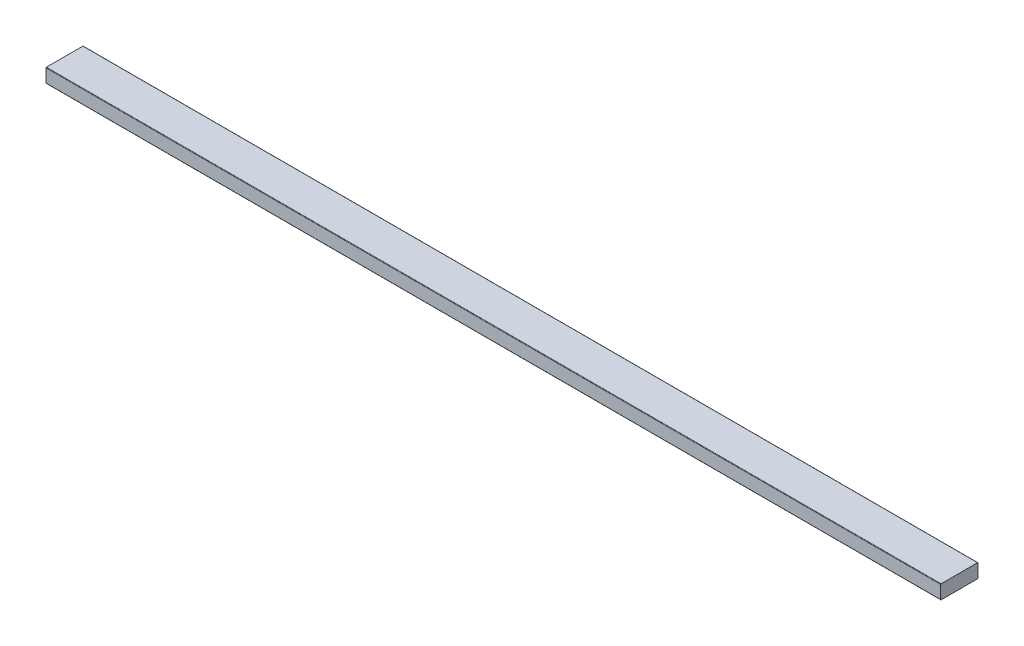
ISO-10303-21;
HEADER;
FILE_DESCRIPTION(('STEP AP214'),'2;1');
FILE_NAME('part.step','',(''),(''),'','','');
FILE_SCHEMA(('AUTOMOTIVE_DESIGN { 1 0 10303 214 1 1 1 1 }'));
ENDSEC;
DATA;
#1=APPLICATION_CONTEXT('core data for automotive mechanical design processes');
#2=APPLICATION_PROTOCOL_DEFINITION('international standard','automotive_design',2000,#1);
#3=PRODUCT_CONTEXT('',#1,'mechanical');
#4=PRODUCT('Part','Part','',(#3));
#5=PRODUCT_RELATED_PRODUCT_CATEGORY('part','',(#4));
#6=PRODUCT_DEFINITION_FORMATION('','',#4);
#7=PRODUCT_DEFINITION_CONTEXT('part definition',#1,'design');
#8=PRODUCT_DEFINITION('design','',#6,#7);
#9=PRODUCT_DEFINITION_SHAPE('','',#8);
#10=(LENGTH_UNIT() NAMED_UNIT(*) SI_UNIT(.MILLI.,.METRE.));
#11=(NAMED_UNIT(*) PLANE_ANGLE_UNIT() SI_UNIT($,.RADIAN.));
#12=(NAMED_UNIT(*) SI_UNIT($,.STERADIAN.) SOLID_ANGLE_UNIT());
#13=UNCERTAINTY_MEASURE_WITH_UNIT(LENGTH_MEASURE(1.E-05),#10,'distance_accuracy_value','');
#14=(GEOMETRIC_REPRESENTATION_CONTEXT(3) GLOBAL_UNCERTAINTY_ASSIGNED_CONTEXT((#13)) GLOBAL_UNIT_ASSIGNED_CONTEXT((#10,
#11,#12)) REPRESENTATION_CONTEXT('',''));
#15=CARTESIAN_POINT('',(0.,0.,0.));
#16=DIRECTION('',(0.,0.,1.));
#17=DIRECTION('',(1.,0.,0.));
#18=AXIS2_PLACEMENT_3D('',#15,#16,#17);
#19=CARTESIAN_POINT('',(-304.8,-4.76250000000001,-12.7));
#20=DIRECTION('',(-1.,0.,0.));
#21=DIRECTION('',(0.,0.,1.));
#22=AXIS2_PLACEMENT_3D('',#19,#20,#21);
#23=PLANE('',#22);
#24=DIRECTION('',(0.,0.,1.));
#25=VECTOR('',#24,1.);
#26=CARTESIAN_POINT('',(-304.8,-4.76250000000001,-12.7));
#27=LINE('',#26,#25);
#28=CARTESIAN_POINT('',(-304.8,-4.76250000000001,-12.385675));
#29=VERTEX_POINT('',#28);
#30=CARTESIAN_POINT('',(-304.8,-4.76250000000001,12.385675));
#31=VERTEX_POINT('',#30);
#32=EDGE_CURVE('E191',#29,#31,#27,.T.);
#33=ORIENTED_EDGE('',*,*,#32,.T.);
#34=CARTESIAN_POINT('',(-304.8,-4.44817500000001,12.385675));
#35=DIRECTION('',(-1.,0.,0.));
#36=DIRECTION('',(0.,0.,1.));
#37=AXIS2_PLACEMENT_3D('',#34,#35,#36);
#38=CIRCLE('',#37,0.314325);
#39=CARTESIAN_POINT('',(-304.8,-4.44817500000001,12.7));
#40=VERTEX_POINT('',#39);
#41=EDGE_CURVE('E169',#31,#40,#38,.T.);
#42=ORIENTED_EDGE('',*,*,#41,.T.);
#43=DIRECTION('',(0.,1.,0.));
#44=VECTOR('',#43,1.);
#45=CARTESIAN_POINT('',(-304.8,-4.76250000000001,12.7));
#46=LINE('',#45,#44);
#47=CARTESIAN_POINT('',(-304.8,4.44817499999999,12.7));
#48=VERTEX_POINT('',#47);
#49=EDGE_CURVE('E130',#40,#48,#46,.T.);
#50=ORIENTED_EDGE('',*,*,#49,.T.);
#51=CARTESIAN_POINT('',(-304.8,4.44817499999999,12.385675));
#52=DIRECTION('',(-1.,0.,0.));
#53=DIRECTION('',(0.,0.,1.));
#54=AXIS2_PLACEMENT_3D('',#51,#52,#53);
#55=CIRCLE('',#54,0.314325);
#56=CARTESIAN_POINT('',(-304.8,4.76249999999999,12.385675));
#57=VERTEX_POINT('',#56);
#58=EDGE_CURVE('E162',#48,#57,#55,.T.);
#59=ORIENTED_EDGE('',*,*,#58,.T.);
#60=DIRECTION('',(0.,0.,1.));
#61=VECTOR('',#60,1.);
#62=CARTESIAN_POINT('',(-304.8,4.76249999999999,-12.7));
#63=LINE('',#62,#61);
#64=CARTESIAN_POINT('',(-304.8,4.76249999999999,-12.385675));
#65=VERTEX_POINT('',#64);
#66=EDGE_CURVE('E186',#65,#57,#63,.T.);
#67=ORIENTED_EDGE('',*,*,#66,.F.);
#68=CARTESIAN_POINT('',(-304.8,4.44817499999999,-12.385675));
#69=DIRECTION('',(-1.,0.,0.));
#70=DIRECTION('',(0.,0.,1.));
#71=AXIS2_PLACEMENT_3D('',#68,#69,#70);
#72=CIRCLE('',#71,0.314325);
#73=CARTESIAN_POINT('',(-304.8,4.44817499999999,-12.7));
#74=VERTEX_POINT('',#73);
#75=EDGE_CURVE('E57',#65,#74,#72,.T.);
#76=ORIENTED_EDGE('',*,*,#75,.T.);
#77=DIRECTION('',(0.,1.,0.));
#78=VECTOR('',#77,1.);
#79=CARTESIAN_POINT('',(-304.8,-4.76250000000001,-12.7));
#80=LINE('',#79,#78);
#81=CARTESIAN_POINT('',(-304.8,-4.44817500000001,-12.7));
#82=VERTEX_POINT('',#81);
#83=EDGE_CURVE('E143',#82,#74,#80,.T.);
#84=ORIENTED_EDGE('',*,*,#83,.F.);
#85=CARTESIAN_POINT('',(-304.8,-4.44817500000001,-12.385675));
#86=DIRECTION('',(-1.,0.,0.));
#87=DIRECTION('',(0.,0.,1.));
#88=AXIS2_PLACEMENT_3D('',#85,#86,#87);
#89=CIRCLE('',#88,0.314325);
#90=EDGE_CURVE('E65',#82,#29,#89,.T.);
#91=ORIENTED_EDGE('',*,*,#90,.T.);
#92=EDGE_LOOP('',(#33,#42,#50,#59,#67,#76,#84,#91));
#93=FACE_BOUND('',#92,.T.);
#94=ADVANCED_FACE('F41',(#93),#23,.T.);
#95=CARTESIAN_POINT('',(-304.8,-4.76250000000001,-12.7));
#96=DIRECTION('',(0.,0.,-1.));
#97=DIRECTION('',(-1.,0.,0.));
#98=AXIS2_PLACEMENT_3D('',#95,#96,#97);
#99=PLANE('',#98);
#100=DIRECTION('',(0.,1.,0.));
#101=VECTOR('',#100,1.);
#102=CARTESIAN_POINT('',(304.8,-4.76250000000001,-12.7));
#103=LINE('',#102,#101);
#104=CARTESIAN_POINT('',(304.8,-4.44817500000001,-12.7));
#105=VERTEX_POINT('',#104);
#106=CARTESIAN_POINT('',(304.8,4.44817499999999,-12.7));
#107=VERTEX_POINT('',#106);
#108=EDGE_CURVE('E138',#105,#107,#103,.T.);
#109=ORIENTED_EDGE('',*,*,#108,.F.);
#110=DIRECTION('',(-1.,0.,0.));
#111=VECTOR('',#110,1.);
#112=CARTESIAN_POINT('',(-304.8,-4.44817500000001,-12.7));
#113=LINE('',#112,#111);
#114=EDGE_CURVE('E175',#105,#82,#113,.T.);
#115=ORIENTED_EDGE('',*,*,#114,.T.);
#116=ORIENTED_EDGE('',*,*,#83,.T.);
#117=DIRECTION('',(-1.,0.,0.));
#118=VECTOR('',#117,1.);
#119=CARTESIAN_POINT('',(-304.8,4.44817499999999,-12.7));
#120=LINE('',#119,#118);
#121=EDGE_CURVE('E172',#74,#107,#120,.F.);
#122=ORIENTED_EDGE('',*,*,#121,.T.);
#123=EDGE_LOOP('',(#109,#115,#116,#122));
#124=FACE_BOUND('',#123,.T.);
#125=ADVANCED_FACE('F204',(#124),#99,.T.);
#126=CARTESIAN_POINT('',(304.8,-4.76250000000001,-12.7));
#127=DIRECTION('',(1.,0.,0.));
#128=DIRECTION('',(0.,0.,-1.));
#129=AXIS2_PLACEMENT_3D('',#126,#127,#128);
#130=PLANE('',#129);
#131=DIRECTION('',(0.,1.,0.));
#132=VECTOR('',#131,1.);
#133=CARTESIAN_POINT('',(304.8,-4.76250000000001,12.7));
#134=LINE('',#133,#132);
#135=CARTESIAN_POINT('',(304.8,-4.44817500000001,12.7));
#136=VERTEX_POINT('',#135);
#137=CARTESIAN_POINT('',(304.8,4.44817499999999,12.7));
#138=VERTEX_POINT('',#137);
#139=EDGE_CURVE('E127',#136,#138,#134,.T.);
#140=ORIENTED_EDGE('',*,*,#139,.F.);
#141=CARTESIAN_POINT('',(304.8,-4.44817500000001,12.385675));
#142=DIRECTION('',(1.,0.,0.));
#143=DIRECTION('',(0.,0.,-1.));
#144=AXIS2_PLACEMENT_3D('',#141,#142,#143);
#145=CIRCLE('',#144,0.314325);
#146=CARTESIAN_POINT('',(304.8,-4.76250000000001,12.385675));
#147=VERTEX_POINT('',#146);
#148=EDGE_CURVE('E109',#136,#147,#145,.T.);
#149=ORIENTED_EDGE('',*,*,#148,.T.);
#150=DIRECTION('',(0.,0.,-1.));
#151=VECTOR('',#150,1.);
#152=CARTESIAN_POINT('',(304.8,-4.76250000000001,-12.7));
#153=LINE('',#152,#151);
#154=CARTESIAN_POINT('',(304.8,-4.76250000000001,-12.385675));
#155=VERTEX_POINT('',#154);
#156=EDGE_CURVE('E145',#147,#155,#153,.T.);
#157=ORIENTED_EDGE('',*,*,#156,.T.);
#158=CARTESIAN_POINT('',(304.8,-4.44817500000001,-12.385675));
#159=DIRECTION('',(1.,0.,0.));
#160=DIRECTION('',(0.,0.,-1.));
#161=AXIS2_PLACEMENT_3D('',#158,#159,#160);
#162=CIRCLE('',#161,0.314325);
#163=EDGE_CURVE('E121',#155,#105,#162,.T.);
#164=ORIENTED_EDGE('',*,*,#163,.T.);
#165=ORIENTED_EDGE('',*,*,#108,.T.);
#166=CARTESIAN_POINT('',(304.8,4.44817499999999,-12.385675));
#167=DIRECTION('',(1.,0.,0.));
#168=DIRECTION('',(0.,0.,-1.));
#169=AXIS2_PLACEMENT_3D('',#166,#167,#168);
#170=CIRCLE('',#169,0.314325);
#171=CARTESIAN_POINT('',(304.8,4.76249999999999,-12.385675));
#172=VERTEX_POINT('',#171);
#173=EDGE_CURVE('E153',#107,#172,#170,.T.);
#174=ORIENTED_EDGE('',*,*,#173,.T.);
#175=DIRECTION('',(0.,0.,-1.));
#176=VECTOR('',#175,1.);
#177=CARTESIAN_POINT('',(304.8,4.76249999999999,-12.7));
#178=LINE('',#177,#176);
#179=CARTESIAN_POINT('',(304.8,4.76249999999999,12.385675));
#180=VERTEX_POINT('',#179);
#181=EDGE_CURVE('E184',#180,#172,#178,.T.);
#182=ORIENTED_EDGE('',*,*,#181,.F.);
#183=CARTESIAN_POINT('',(304.8,4.44817499999999,12.385675));
#184=DIRECTION('',(1.,0.,0.));
#185=DIRECTION('',(0.,0.,-1.));
#186=AXIS2_PLACEMENT_3D('',#183,#184,#185);
#187=CIRCLE('',#186,0.314325);
#188=EDGE_CURVE('E132',#180,#138,#187,.T.);
#189=ORIENTED_EDGE('',*,*,#188,.T.);
#190=EDGE_LOOP('',(#140,#149,#157,#164,#165,#174,#182,#189));
#191=FACE_BOUND('',#190,.T.);
#192=ADVANCED_FACE('F135',(#191),#130,.T.);
#193=CARTESIAN_POINT('',(-304.8,-4.76250000000001,12.7));
#194=DIRECTION('',(0.,0.,1.));
#195=DIRECTION('',(1.,0.,0.));
#196=AXIS2_PLACEMENT_3D('',#193,#194,#195);
#197=PLANE('',#196);
#198=ORIENTED_EDGE('',*,*,#49,.F.);
#199=DIRECTION('',(1.,0.,0.));
#200=VECTOR('',#199,1.);
#201=CARTESIAN_POINT('',(304.8,-4.44817500000001,12.7));
#202=LINE('',#201,#200);
#203=EDGE_CURVE('E113',#40,#136,#202,.T.);
#204=ORIENTED_EDGE('',*,*,#203,.T.);
#205=ORIENTED_EDGE('',*,*,#139,.T.);
#206=DIRECTION('',(1.,0.,0.));
#207=VECTOR('',#206,1.);
#208=CARTESIAN_POINT('',(-304.8,4.44817499999999,12.7));
#209=LINE('',#208,#207);
#210=EDGE_CURVE('E133',#138,#48,#209,.F.);
#211=ORIENTED_EDGE('',*,*,#210,.T.);
#212=EDGE_LOOP('',(#198,#204,#205,#211));
#213=FACE_BOUND('',#212,.T.);
#214=ADVANCED_FACE('F126',(#213),#197,.T.);
#215=CARTESIAN_POINT('',(0.,-4.76250000000001,0.));
#216=DIRECTION('',(0.,1.,0.));
#217=DIRECTION('',(0.,0.,1.));
#218=AXIS2_PLACEMENT_3D('',#215,#216,#217);
#219=PLANE('',#218);
#220=ORIENTED_EDGE('',*,*,#156,.F.);
#221=DIRECTION('',(1.,0.,0.));
#222=VECTOR('',#221,1.);
#223=CARTESIAN_POINT('',(-304.8,-4.76250000000001,12.385675));
#224=LINE('',#223,#222);
#225=EDGE_CURVE('E114',#147,#31,#224,.F.);
#226=ORIENTED_EDGE('',*,*,#225,.T.);
#227=ORIENTED_EDGE('',*,*,#32,.F.);
#228=DIRECTION('',(-1.,0.,0.));
#229=VECTOR('',#228,1.);
#230=CARTESIAN_POINT('',(304.8,-4.76250000000001,-12.385675));
#231=LINE('',#230,#229);
#232=EDGE_CURVE('E120',#29,#155,#231,.F.);
#233=ORIENTED_EDGE('',*,*,#232,.T.);
#234=EDGE_LOOP('',(#220,#226,#227,#233));
#235=FACE_BOUND('',#234,.T.);
#236=ADVANCED_FACE('F228',(#235),#219,.F.);
#237=CARTESIAN_POINT('',(0.,4.76249999999999,0.));
#238=DIRECTION('',(0.,1.,0.));
#239=DIRECTION('',(0.,0.,1.));
#240=AXIS2_PLACEMENT_3D('',#237,#238,#239);
#241=PLANE('',#240);
#242=ORIENTED_EDGE('',*,*,#181,.T.);
#243=DIRECTION('',(-1.,0.,0.));
#244=VECTOR('',#243,1.);
#245=CARTESIAN_POINT('',(0.,4.76249999999999,-12.385675));
#246=LINE('',#245,#244);
#247=EDGE_CURVE('E11',#172,#65,#246,.T.);
#248=ORIENTED_EDGE('',*,*,#247,.T.);
#249=ORIENTED_EDGE('',*,*,#66,.T.);
#250=DIRECTION('',(1.,0.,0.));
#251=VECTOR('',#250,1.);
#252=CARTESIAN_POINT('',(0.,4.76249999999999,12.385675));
#253=LINE('',#252,#251);
#254=EDGE_CURVE('E50',#57,#180,#253,.T.);
#255=ORIENTED_EDGE('',*,*,#254,.T.);
#256=EDGE_LOOP('',(#242,#248,#249,#255));
#257=FACE_BOUND('',#256,.T.);
#258=ADVANCED_FACE('F183',(#257),#241,.T.);
#259=CARTESIAN_POINT('',(-304.8,-4.44817500000001,12.385675));
#260=DIRECTION('',(-1.,0.,0.));
#261=DIRECTION('',(0.,0.,1.));
#262=AXIS2_PLACEMENT_3D('',#259,#260,#261);
#263=CYLINDRICAL_SURFACE('',#262,0.314325);
#264=ORIENTED_EDGE('',*,*,#41,.F.);
#265=ORIENTED_EDGE('',*,*,#225,.F.);
#266=ORIENTED_EDGE('',*,*,#148,.F.);
#267=ORIENTED_EDGE('',*,*,#203,.F.);
#268=EDGE_LOOP('',(#264,#265,#266,#267));
#269=FACE_BOUND('',#268,.T.);
#270=ADVANCED_FACE('F112',(#269),#263,.T.);
#271=CARTESIAN_POINT('',(-304.8,-4.44817500000001,-12.385675));
#272=DIRECTION('',(1.,0.,0.));
#273=DIRECTION('',(0.,0.,-1.));
#274=AXIS2_PLACEMENT_3D('',#271,#272,#273);
#275=CYLINDRICAL_SURFACE('',#274,0.314325);
#276=ORIENTED_EDGE('',*,*,#163,.F.);
#277=ORIENTED_EDGE('',*,*,#232,.F.);
#278=ORIENTED_EDGE('',*,*,#90,.F.);
#279=ORIENTED_EDGE('',*,*,#114,.F.);
#280=EDGE_LOOP('',(#276,#277,#278,#279));
#281=FACE_BOUND('',#280,.T.);
#282=ADVANCED_FACE('F211',(#281),#275,.T.);
#283=CARTESIAN_POINT('',(0.,4.44817499999999,-12.385675));
#284=DIRECTION('',(-1.,0.,0.));
#285=DIRECTION('',(0.,0.,1.));
#286=AXIS2_PLACEMENT_3D('',#283,#284,#285);
#287=CYLINDRICAL_SURFACE('',#286,0.314325);
#288=ORIENTED_EDGE('',*,*,#173,.F.);
#289=ORIENTED_EDGE('',*,*,#121,.F.);
#290=ORIENTED_EDGE('',*,*,#75,.F.);
#291=ORIENTED_EDGE('',*,*,#247,.F.);
#292=EDGE_LOOP('',(#288,#289,#290,#291));
#293=FACE_BOUND('',#292,.T.);
#294=ADVANCED_FACE('F206',(#293),#287,.T.);
#295=CARTESIAN_POINT('',(0.,4.44817499999999,12.385675));
#296=DIRECTION('',(1.,0.,0.));
#297=DIRECTION('',(0.,0.,-1.));
#298=AXIS2_PLACEMENT_3D('',#295,#296,#297);
#299=CYLINDRICAL_SURFACE('',#298,0.314325);
#300=ORIENTED_EDGE('',*,*,#58,.F.);
#301=ORIENTED_EDGE('',*,*,#210,.F.);
#302=ORIENTED_EDGE('',*,*,#188,.F.);
#303=ORIENTED_EDGE('',*,*,#254,.F.);
#304=EDGE_LOOP('',(#300,#301,#302,#303));
#305=FACE_BOUND('',#304,.T.);
#306=ADVANCED_FACE('F43',(#305),#299,.T.);
#307=CLOSED_SHELL('',(#94,#125,#192,#214,#236,#258,#270,#282,#294,#306));
#308=MANIFOLD_SOLID_BREP('B2',#307);
#309=ADVANCED_BREP_SHAPE_REPRESENTATION('',(#18,#308),#14);
#310=SHAPE_DEFINITION_REPRESENTATION(#9,#309);
ENDSEC;
END-ISO-10303-21;
